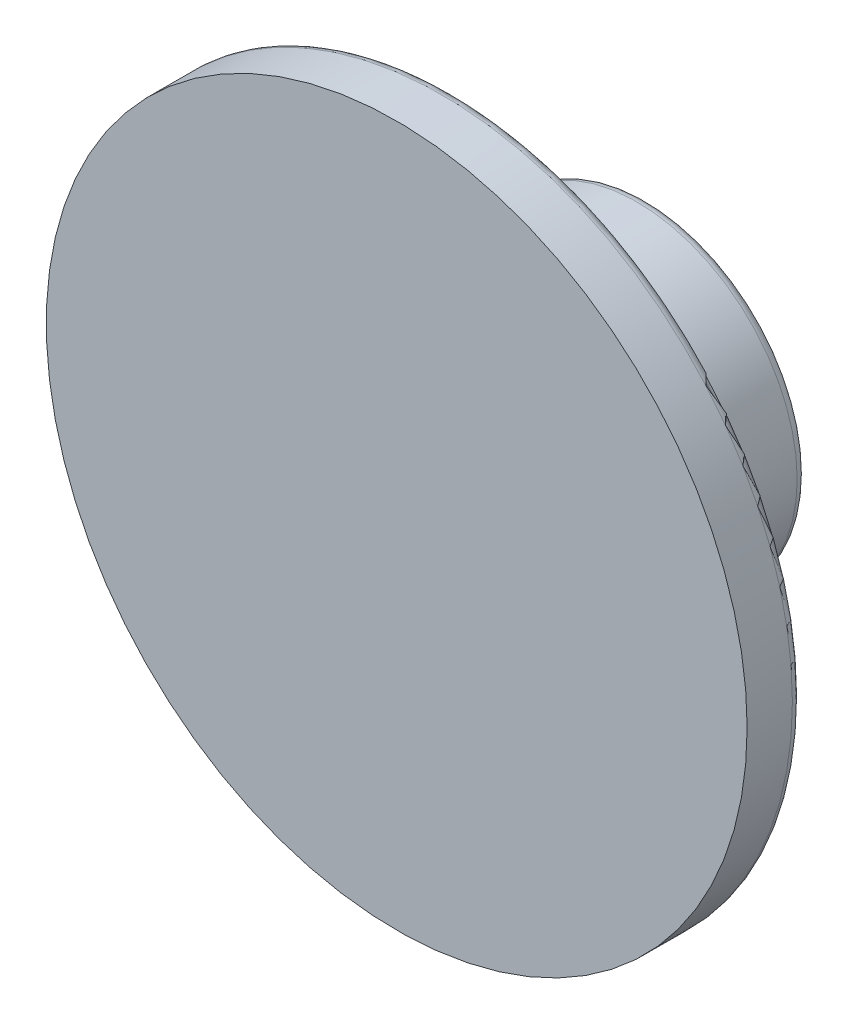
ISO-10303-21;
HEADER;
FILE_DESCRIPTION(('STEP AP214'),'2;1');
FILE_NAME('part.step','',(''),(''),'','','');
FILE_SCHEMA(('AUTOMOTIVE_DESIGN { 1 0 10303 214 1 1 1 1 }'));
ENDSEC;
DATA;
#1=APPLICATION_CONTEXT('core data for automotive mechanical design processes');
#2=APPLICATION_PROTOCOL_DEFINITION('international standard','automotive_design',2000,#1);
#3=PRODUCT_CONTEXT('',#1,'mechanical');
#4=PRODUCT('Part','Part','',(#3));
#5=PRODUCT_RELATED_PRODUCT_CATEGORY('part','',(#4));
#6=PRODUCT_DEFINITION_FORMATION('','',#4);
#7=PRODUCT_DEFINITION_CONTEXT('part definition',#1,'design');
#8=PRODUCT_DEFINITION('design','',#6,#7);
#9=PRODUCT_DEFINITION_SHAPE('','',#8);
#10=(LENGTH_UNIT() NAMED_UNIT(*) SI_UNIT(.MILLI.,.METRE.));
#11=(NAMED_UNIT(*) PLANE_ANGLE_UNIT() SI_UNIT($,.RADIAN.));
#12=(NAMED_UNIT(*) SI_UNIT($,.STERADIAN.) SOLID_ANGLE_UNIT());
#13=UNCERTAINTY_MEASURE_WITH_UNIT(LENGTH_MEASURE(1.E-05),#10,'distance_accuracy_value','');
#14=(GEOMETRIC_REPRESENTATION_CONTEXT(3) GLOBAL_UNCERTAINTY_ASSIGNED_CONTEXT((#13)) GLOBAL_UNIT_ASSIGNED_CONTEXT((#10,
#11,#12)) REPRESENTATION_CONTEXT('',''));
#15=CARTESIAN_POINT('',(0.,0.,0.));
#16=DIRECTION('',(0.,0.,1.));
#17=DIRECTION('',(1.,0.,0.));
#18=AXIS2_PLACEMENT_3D('',#15,#16,#17);
#19=CARTESIAN_POINT('',(0.,0.,-15.));
#20=DIRECTION('',(0.,0.,1.));
#21=DIRECTION('',(1.,0.,0.));
#22=AXIS2_PLACEMENT_3D('',#19,#20,#21);
#23=PLANE('',#22);
#24=CARTESIAN_POINT('',(0.,0.,-15.));
#25=DIRECTION('',(0.,0.,1.));
#26=DIRECTION('',(1.,0.,0.));
#27=AXIS2_PLACEMENT_3D('',#24,#25,#26);
#28=CIRCLE('',#27,6.);
#29=CARTESIAN_POINT('',(6.,0.,-15.));
#30=VERTEX_POINT('',#29);
#31=EDGE_CURVE('E57',#30,#30,#28,.T.);
#32=ORIENTED_EDGE('',*,*,#31,.F.);
#33=EDGE_LOOP('',(#32));
#34=FACE_BOUND('',#33,.T.);
#35=ADVANCED_FACE('F31',(#34),#23,.F.);
#36=CARTESIAN_POINT('',(0.,0.,0.));
#37=DIRECTION('',(0.,0.,1.));
#38=DIRECTION('',(1.,0.,0.));
#39=AXIS2_PLACEMENT_3D('',#36,#37,#38);
#40=CYLINDRICAL_SURFACE('',#39,6.);
#41=CARTESIAN_POINT('',(0.,0.,-25.));
#42=DIRECTION('',(0.,0.,1.));
#43=DIRECTION('',(1.,0.,0.));
#44=AXIS2_PLACEMENT_3D('',#41,#42,#43);
#45=CIRCLE('',#44,6.);
#46=CARTESIAN_POINT('',(6.,0.,-25.));
#47=VERTEX_POINT('',#46);
#48=EDGE_CURVE('E60',#47,#47,#45,.T.);
#49=ORIENTED_EDGE('',*,*,#48,.F.);
#50=EDGE_LOOP('',(#49));
#51=FACE_BOUND('',#50,.T.);
#52=ORIENTED_EDGE('',*,*,#31,.T.);
#53=EDGE_LOOP('',(#52));
#54=FACE_BOUND('',#53,.T.);
#55=ADVANCED_FACE('F83',(#51,#54),#40,.F.);
#56=CARTESIAN_POINT('',(-6.,0.,-25.));
#57=DIRECTION('',(0.,0.,1.));
#58=DIRECTION('',(1.,0.,0.));
#59=AXIS2_PLACEMENT_3D('',#56,#57,#58);
#60=PLANE('',#59);
#61=CARTESIAN_POINT('',(0.,0.,-25.));
#62=DIRECTION('',(0.,0.,1.));
#63=DIRECTION('',(1.,0.,0.));
#64=AXIS2_PLACEMENT_3D('',#61,#62,#63);
#65=CIRCLE('',#64,15.);
#66=CARTESIAN_POINT('',(15.,0.,-25.));
#67=VERTEX_POINT('',#66);
#68=EDGE_CURVE('E38',#67,#67,#65,.F.);
#69=ORIENTED_EDGE('',*,*,#68,.T.);
#70=EDGE_LOOP('',(#69));
#71=FACE_BOUND('',#70,.T.);
#72=ORIENTED_EDGE('',*,*,#48,.T.);
#73=EDGE_LOOP('',(#72));
#74=FACE_BOUND('',#73,.T.);
#75=ADVANCED_FACE('F89',(#71,#74),#60,.F.);
#76=CARTESIAN_POINT('',(0.,0.,0.));
#77=DIRECTION('',(0.,0.,1.));
#78=DIRECTION('',(1.,0.,0.));
#79=AXIS2_PLACEMENT_3D('',#76,#77,#78);
#80=CYLINDRICAL_SURFACE('',#79,16.);
#81=CARTESIAN_POINT('',(0.,0.,-15.3373259220235));
#82=DIRECTION('',(0.,0.,1.));
#83=DIRECTION('',(1.,0.,0.));
#84=AXIS2_PLACEMENT_3D('',#81,#82,#83);
#85=CIRCLE('',#84,16.);
#86=CARTESIAN_POINT('',(16.,0.,-15.3373259220235));
#87=VERTEX_POINT('',#86);
#88=EDGE_CURVE('E42',#87,#87,#85,.F.);
#89=ORIENTED_EDGE('',*,*,#88,.T.);
#90=EDGE_LOOP('',(#89));
#91=FACE_BOUND('',#90,.T.);
#92=CARTESIAN_POINT('',(0.,0.,-24.));
#93=DIRECTION('',(0.,0.,1.));
#94=DIRECTION('',(1.,0.,0.));
#95=AXIS2_PLACEMENT_3D('',#92,#93,#94);
#96=CIRCLE('',#95,16.);
#97=CARTESIAN_POINT('',(16.,0.,-24.));
#98=VERTEX_POINT('',#97);
#99=EDGE_CURVE('E46',#98,#98,#96,.T.);
#100=ORIENTED_EDGE('',*,*,#99,.T.);
#101=EDGE_LOOP('',(#100));
#102=FACE_BOUND('',#101,.T.);
#103=ADVANCED_FACE('F79',(#91,#102),#80,.T.);
#104=CARTESIAN_POINT('',(0.,0.,-29.25));
#105=DIRECTION('',(0.,0.,1.));
#106=DIRECTION('',(1.,0.,0.));
#107=AXIS2_PLACEMENT_3D('',#104,#105,#106);
#108=TOROIDAL_SURFACE('',#107,35.,23.75);
#109=CARTESIAN_POINT('',(0.,0.,-14.7257798087058));
#110=DIRECTION('',(0.,0.,-1.));
#111=DIRECTION('',(-1.,0.,0.));
#112=AXIS2_PLACEMENT_3D('',#109,#110,#111);
#113=CIRCLE('',#112,16.2087912087912);
#114=CARTESIAN_POINT('',(-16.2087912087912,0.,-14.7257798087058));
#115=VERTEX_POINT('',#114);
#116=EDGE_CURVE('E51',#115,#115,#113,.F.);
#117=ORIENTED_EDGE('',*,*,#116,.T.);
#118=EDGE_LOOP('',(#117));
#119=FACE_BOUND('',#118,.T.);
#120=CARTESIAN_POINT('',(0.,0.,-5.51939369517921));
#121=DIRECTION('',(0.,0.,-1.));
#122=DIRECTION('',(-1.,0.,0.));
#123=AXIS2_PLACEMENT_3D('',#120,#121,#122);
#124=CIRCLE('',#123,34.040404040404);
#125=CARTESIAN_POINT('',(-34.040404040404,0.,-5.51939369517921));
#126=VERTEX_POINT('',#125);
#127=EDGE_CURVE('E54',#126,#126,#124,.T.);
#128=ORIENTED_EDGE('',*,*,#127,.T.);
#129=EDGE_LOOP('',(#128));
#130=FACE_BOUND('',#129,.T.);
#131=ADVANCED_FACE('F71',(#119,#130),#108,.F.);
#132=CARTESIAN_POINT('',(0.,0.,0.));
#133=DIRECTION('',(0.,0.,1.));
#134=DIRECTION('',(1.,0.,0.));
#135=AXIS2_PLACEMENT_3D('',#132,#133,#134);
#136=CYLINDRICAL_SURFACE('',#135,35.);
#137=CARTESIAN_POINT('',(0.,0.,-4.52021027181994));
#138=DIRECTION('',(0.,0.,-1.));
#139=DIRECTION('',(-1.,0.,0.));
#140=AXIS2_PLACEMENT_3D('',#137,#138,#139);
#141=CIRCLE('',#140,35.);
#142=CARTESIAN_POINT('',(-35.,0.,-4.52021027181994));
#143=VERTEX_POINT('',#142);
#144=EDGE_CURVE('E10',#143,#143,#141,.F.);
#145=ORIENTED_EDGE('',*,*,#144,.T.);
#146=EDGE_LOOP('',(#145));
#147=FACE_BOUND('',#146,.T.);
#148=CARTESIAN_POINT('',(0.,0.,0.));
#149=DIRECTION('',(0.,0.,1.));
#150=DIRECTION('',(1.,0.,0.));
#151=AXIS2_PLACEMENT_3D('',#148,#149,#150);
#152=CIRCLE('',#151,35.);
#153=CARTESIAN_POINT('',(35.,0.,0.));
#154=VERTEX_POINT('',#153);
#155=EDGE_CURVE('E63',#154,#154,#152,.T.);
#156=ORIENTED_EDGE('',*,*,#155,.F.);
#157=EDGE_LOOP('',(#156));
#158=FACE_BOUND('',#157,.T.);
#159=ADVANCED_FACE('F69',(#147,#158),#136,.T.);
#160=CARTESIAN_POINT('',(0.,0.,0.));
#161=DIRECTION('',(0.,0.,-1.));
#162=DIRECTION('',(-1.,0.,0.));
#163=AXIS2_PLACEMENT_3D('',#160,#161,#162);
#164=PLANE('',#163);
#165=ORIENTED_EDGE('',*,*,#155,.T.);
#166=EDGE_LOOP('',(#165));
#167=FACE_BOUND('',#166,.T.);
#168=ADVANCED_FACE('F67',(#167),#164,.F.);
#169=CARTESIAN_POINT('',(0.,0.,-15.3373259220235));
#170=DIRECTION('',(0.,0.,1.));
#171=DIRECTION('',(1.,0.,0.));
#172=AXIS2_PLACEMENT_3D('',#169,#170,#171);
#173=TOROIDAL_SURFACE('',#172,17.,1.);
#174=ORIENTED_EDGE('',*,*,#88,.F.);
#175=EDGE_LOOP('',(#174));
#176=FACE_BOUND('',#175,.T.);
#177=ORIENTED_EDGE('',*,*,#116,.F.);
#178=EDGE_LOOP('',(#177));
#179=FACE_BOUND('',#178,.T.);
#180=ADVANCED_FACE('F77',(#176,#179),#173,.F.);
#181=CARTESIAN_POINT('',(0.,0.,-24.));
#182=DIRECTION('',(0.,0.,1.));
#183=DIRECTION('',(1.,0.,0.));
#184=AXIS2_PLACEMENT_3D('',#181,#182,#183);
#185=TOROIDAL_SURFACE('',#184,15.,1.);
#186=ORIENTED_EDGE('',*,*,#68,.F.);
#187=EDGE_LOOP('',(#186));
#188=FACE_BOUND('',#187,.T.);
#189=ORIENTED_EDGE('',*,*,#99,.F.);
#190=EDGE_LOOP('',(#189));
#191=FACE_BOUND('',#190,.T.);
#192=ADVANCED_FACE('F96',(#188,#191),#185,.T.);
#193=CARTESIAN_POINT('',(0.,0.,-4.52021027181994));
#194=DIRECTION('',(0.,0.,-1.));
#195=DIRECTION('',(-1.,0.,0.));
#196=AXIS2_PLACEMENT_3D('',#193,#194,#195);
#197=TOROIDAL_SURFACE('',#196,34.,1.);
#198=ORIENTED_EDGE('',*,*,#127,.F.);
#199=EDGE_LOOP('',(#198));
#200=FACE_BOUND('',#199,.T.);
#201=ORIENTED_EDGE('',*,*,#144,.F.);
#202=EDGE_LOOP('',(#201));
#203=FACE_BOUND('',#202,.T.);
#204=ADVANCED_FACE('F33',(#200,#203),#197,.T.);
#205=CLOSED_SHELL('',(#35,#55,#75,#103,#131,#159,#168,#180,#192,#204));
#206=MANIFOLD_SOLID_BREP('B2',#205);
#207=ADVANCED_BREP_SHAPE_REPRESENTATION('',(#18,#206),#14);
#208=SHAPE_DEFINITION_REPRESENTATION(#9,#207);
ENDSEC;
END-ISO-10303-21;
